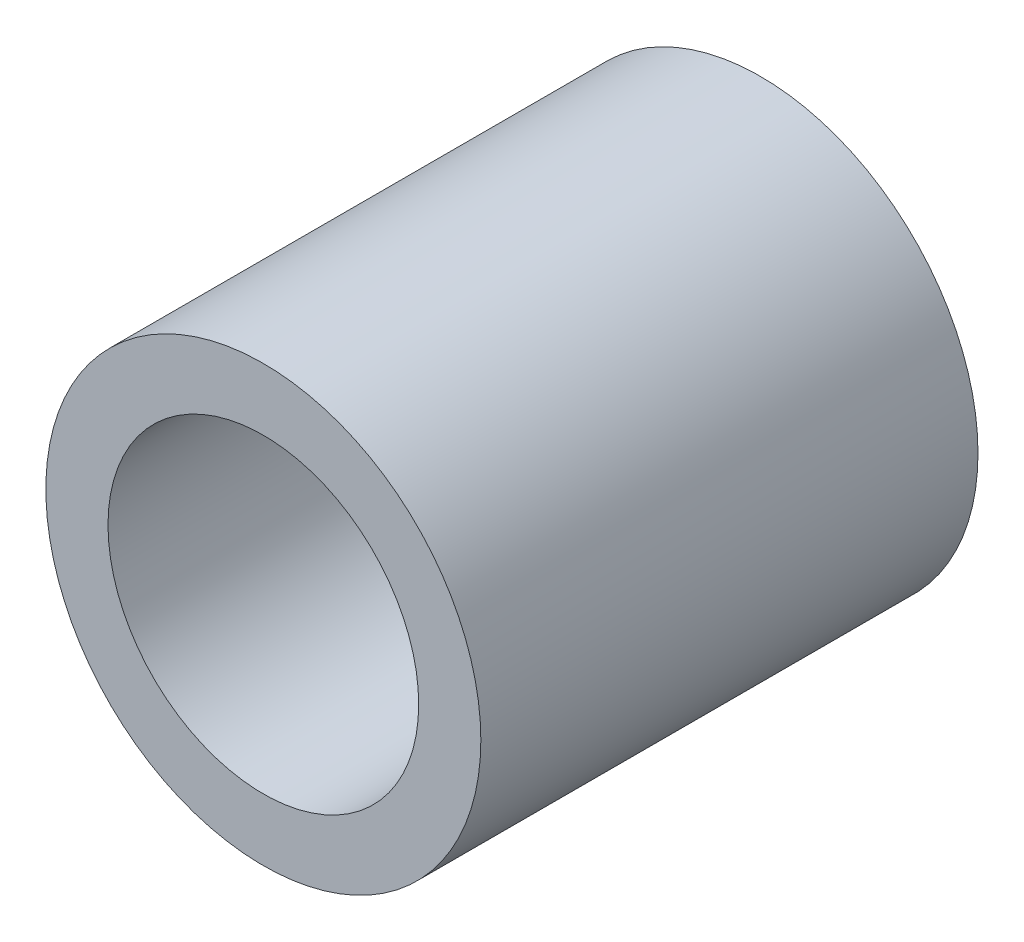
ISO-10303-21;
HEADER;
FILE_DESCRIPTION(('STEP AP214'),'2;1');
FILE_NAME('part.step','',(''),(''),'','','');
FILE_SCHEMA(('AUTOMOTIVE_DESIGN { 1 0 10303 214 1 1 1 1 }'));
ENDSEC;
DATA;
#1=APPLICATION_CONTEXT('core data for automotive mechanical design processes');
#2=APPLICATION_PROTOCOL_DEFINITION('international standard','automotive_design',2000,#1);
#3=PRODUCT_CONTEXT('',#1,'mechanical');
#4=PRODUCT('Part','Part','',(#3));
#5=PRODUCT_RELATED_PRODUCT_CATEGORY('part','',(#4));
#6=PRODUCT_DEFINITION_FORMATION('','',#4);
#7=PRODUCT_DEFINITION_CONTEXT('part definition',#1,'design');
#8=PRODUCT_DEFINITION('design','',#6,#7);
#9=PRODUCT_DEFINITION_SHAPE('','',#8);
#10=(LENGTH_UNIT() NAMED_UNIT(*) SI_UNIT(.MILLI.,.METRE.));
#11=(NAMED_UNIT(*) PLANE_ANGLE_UNIT() SI_UNIT($,.RADIAN.));
#12=(NAMED_UNIT(*) SI_UNIT($,.STERADIAN.) SOLID_ANGLE_UNIT());
#13=UNCERTAINTY_MEASURE_WITH_UNIT(LENGTH_MEASURE(1.E-05),#10,'distance_accuracy_value','');
#14=(GEOMETRIC_REPRESENTATION_CONTEXT(3) GLOBAL_UNCERTAINTY_ASSIGNED_CONTEXT((#13)) GLOBAL_UNIT_ASSIGNED_CONTEXT((#10,
#11,#12)) REPRESENTATION_CONTEXT('',''));
#15=CARTESIAN_POINT('',(0.,0.,0.));
#16=DIRECTION('',(0.,0.,1.));
#17=DIRECTION('',(1.,0.,0.));
#18=AXIS2_PLACEMENT_3D('',#15,#16,#17);
#19=CARTESIAN_POINT('',(0.,0.,25.4));
#20=DIRECTION('',(0.,0.,1.));
#21=DIRECTION('',(1.,0.,0.));
#22=AXIS2_PLACEMENT_3D('',#19,#20,#21);
#23=PLANE('',#22);
#24=CARTESIAN_POINT('',(0.,0.,25.4));
#25=DIRECTION('',(0.,0.,1.));
#26=DIRECTION('',(1.,0.,0.));
#27=AXIS2_PLACEMENT_3D('',#24,#25,#26);
#28=CIRCLE('',#27,11.1125);
#29=CARTESIAN_POINT('',(11.1125,0.,25.4));
#30=VERTEX_POINT('',#29);
#31=EDGE_CURVE('E10',#30,#30,#28,.T.);
#32=ORIENTED_EDGE('',*,*,#31,.T.);
#33=EDGE_LOOP('',(#32));
#34=FACE_BOUND('',#33,.T.);
#35=CARTESIAN_POINT('',(0.,0.,25.4));
#36=DIRECTION('',(0.,0.,1.));
#37=DIRECTION('',(1.,0.,0.));
#38=AXIS2_PLACEMENT_3D('',#35,#36,#37);
#39=CIRCLE('',#38,7.9375);
#40=CARTESIAN_POINT('',(7.9375,0.,25.4));
#41=VERTEX_POINT('',#40);
#42=EDGE_CURVE('E42',#41,#41,#39,.T.);
#43=ORIENTED_EDGE('',*,*,#42,.F.);
#44=EDGE_LOOP('',(#43));
#45=FACE_BOUND('',#44,.T.);
#46=ADVANCED_FACE('F31',(#34,#45),#23,.T.);
#47=CARTESIAN_POINT('',(0.,0.,0.));
#48=DIRECTION('',(0.,0.,1.));
#49=DIRECTION('',(1.,0.,0.));
#50=AXIS2_PLACEMENT_3D('',#47,#48,#49);
#51=PLANE('',#50);
#52=CARTESIAN_POINT('',(0.,0.,0.));
#53=DIRECTION('',(0.,0.,1.));
#54=DIRECTION('',(1.,0.,0.));
#55=AXIS2_PLACEMENT_3D('',#52,#53,#54);
#56=CIRCLE('',#55,11.1125);
#57=CARTESIAN_POINT('',(11.1125,0.,0.));
#58=VERTEX_POINT('',#57);
#59=EDGE_CURVE('E35',#58,#58,#56,.T.);
#60=ORIENTED_EDGE('',*,*,#59,.F.);
#61=EDGE_LOOP('',(#60));
#62=FACE_BOUND('',#61,.T.);
#63=CARTESIAN_POINT('',(0.,0.,0.));
#64=DIRECTION('',(0.,0.,1.));
#65=DIRECTION('',(1.,0.,0.));
#66=AXIS2_PLACEMENT_3D('',#63,#64,#65);
#67=CIRCLE('',#66,7.9375);
#68=CARTESIAN_POINT('',(7.9375,0.,0.));
#69=VERTEX_POINT('',#68);
#70=EDGE_CURVE('E44',#69,#69,#67,.T.);
#71=ORIENTED_EDGE('',*,*,#70,.T.);
#72=EDGE_LOOP('',(#71));
#73=FACE_BOUND('',#72,.T.);
#74=ADVANCED_FACE('F54',(#62,#73),#51,.F.);
#75=CARTESIAN_POINT('',(0.,0.,25.4));
#76=DIRECTION('',(0.,0.,-1.));
#77=DIRECTION('',(-1.,0.,0.));
#78=AXIS2_PLACEMENT_3D('',#75,#76,#77);
#79=CYLINDRICAL_SURFACE('',#78,11.1125);
#80=ORIENTED_EDGE('',*,*,#31,.F.);
#81=EDGE_LOOP('',(#80));
#82=FACE_BOUND('',#81,.T.);
#83=ORIENTED_EDGE('',*,*,#59,.T.);
#84=EDGE_LOOP('',(#83));
#85=FACE_BOUND('',#84,.T.);
#86=ADVANCED_FACE('F33',(#82,#85),#79,.T.);
#87=CARTESIAN_POINT('',(0.,0.,25.4));
#88=DIRECTION('',(0.,0.,-1.));
#89=DIRECTION('',(-1.,0.,0.));
#90=AXIS2_PLACEMENT_3D('',#87,#88,#89);
#91=CYLINDRICAL_SURFACE('',#90,7.9375);
#92=ORIENTED_EDGE('',*,*,#42,.T.);
#93=EDGE_LOOP('',(#92));
#94=FACE_BOUND('',#93,.T.);
#95=ORIENTED_EDGE('',*,*,#70,.F.);
#96=EDGE_LOOP('',(#95));
#97=FACE_BOUND('',#96,.T.);
#98=ADVANCED_FACE('F50',(#94,#97),#91,.F.);
#99=CLOSED_SHELL('',(#46,#74,#86,#98));
#100=MANIFOLD_SOLID_BREP('B2',#99);
#101=ADVANCED_BREP_SHAPE_REPRESENTATION('',(#18,#100),#14);
#102=SHAPE_DEFINITION_REPRESENTATION(#9,#101);
ENDSEC;
END-ISO-10303-21;
